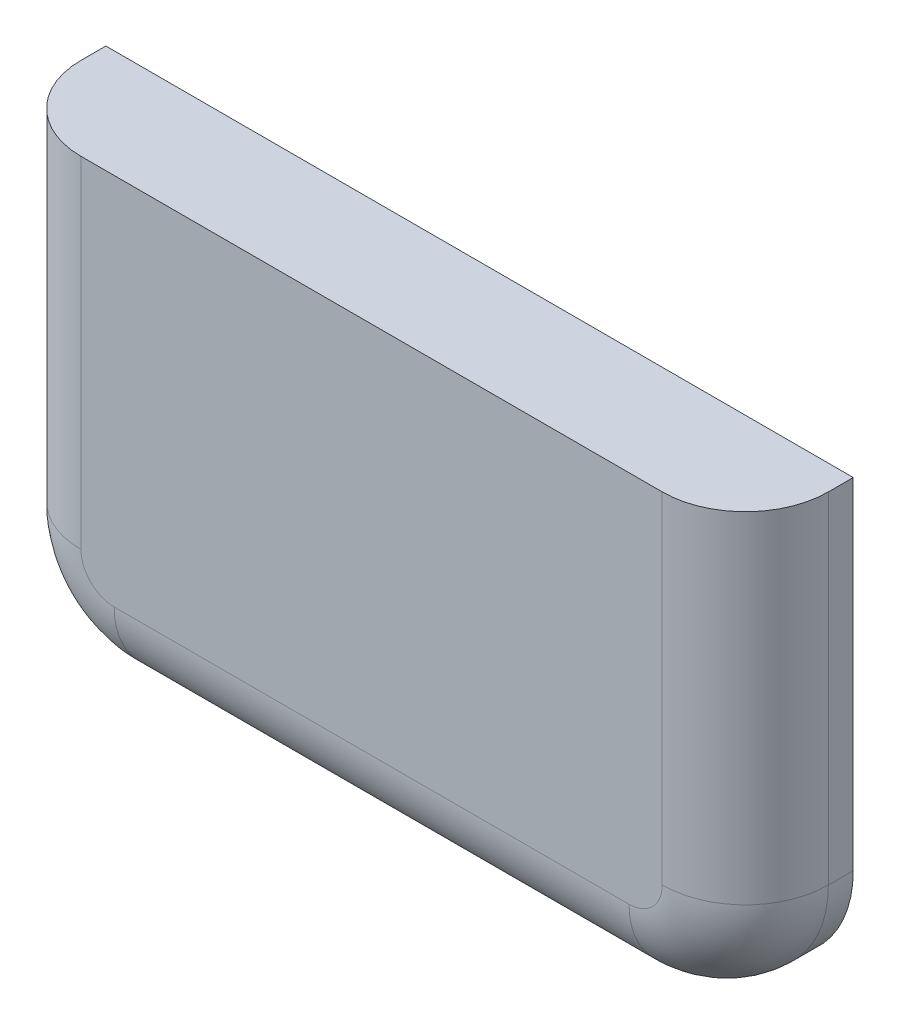
ISO-10303-21;
HEADER;
FILE_DESCRIPTION(('STEP AP214'),'2;1');
FILE_NAME('part.step','',(''),(''),'','','');
FILE_SCHEMA(('AUTOMOTIVE_DESIGN { 1 0 10303 214 1 1 1 1 }'));
ENDSEC;
DATA;
#1=APPLICATION_CONTEXT('core data for automotive mechanical design processes');
#2=APPLICATION_PROTOCOL_DEFINITION('international standard','automotive_design',2000,#1);
#3=PRODUCT_CONTEXT('',#1,'mechanical');
#4=PRODUCT('Part','Part','',(#3));
#5=PRODUCT_RELATED_PRODUCT_CATEGORY('part','',(#4));
#6=PRODUCT_DEFINITION_FORMATION('','',#4);
#7=PRODUCT_DEFINITION_CONTEXT('part definition',#1,'design');
#8=PRODUCT_DEFINITION('design','',#6,#7);
#9=PRODUCT_DEFINITION_SHAPE('','',#8);
#10=(LENGTH_UNIT() NAMED_UNIT(*) SI_UNIT(.MILLI.,.METRE.));
#11=(NAMED_UNIT(*) PLANE_ANGLE_UNIT() SI_UNIT($,.RADIAN.));
#12=(NAMED_UNIT(*) SI_UNIT($,.STERADIAN.) SOLID_ANGLE_UNIT());
#13=UNCERTAINTY_MEASURE_WITH_UNIT(LENGTH_MEASURE(1.E-05),#10,'distance_accuracy_value','');
#14=(GEOMETRIC_REPRESENTATION_CONTEXT(3) GLOBAL_UNCERTAINTY_ASSIGNED_CONTEXT((#13)) GLOBAL_UNIT_ASSIGNED_CONTEXT((#10,
#11,#12)) REPRESENTATION_CONTEXT('',''));
#15=CARTESIAN_POINT('',(0.,0.,0.));
#16=DIRECTION('',(0.,0.,1.));
#17=DIRECTION('',(1.,0.,0.));
#18=AXIS2_PLACEMENT_3D('',#15,#16,#17);
#19=CARTESIAN_POINT('',(-225.,137.5,65.));
#20=DIRECTION('',(0.,1.,0.));
#21=DIRECTION('',(0.,0.,1.));
#22=AXIS2_PLACEMENT_3D('',#19,#20,#21);
#23=PLANE('',#22);
#24=DIRECTION('',(0.,0.,-1.));
#25=VECTOR('',#24,1.);
#26=CARTESIAN_POINT('',(-225.,137.5,65.));
#27=LINE('',#26,#25);
#28=CARTESIAN_POINT('',(-225.,137.5,15.));
#29=VERTEX_POINT('',#28);
#30=CARTESIAN_POINT('',(-225.,137.5,0.));
#31=VERTEX_POINT('',#30);
#32=EDGE_CURVE('E129',#29,#31,#27,.T.);
#33=ORIENTED_EDGE('',*,*,#32,.F.);
#34=CARTESIAN_POINT('',(-175.,137.5,15.));
#35=DIRECTION('',(0.,1.,0.));
#36=DIRECTION('',(0.,0.,1.));
#37=AXIS2_PLACEMENT_3D('',#34,#35,#36);
#38=CIRCLE('',#37,50.);
#39=CARTESIAN_POINT('',(-175.,137.5,65.));
#40=VERTEX_POINT('',#39);
#41=EDGE_CURVE('E183',#29,#40,#38,.T.);
#42=ORIENTED_EDGE('',*,*,#41,.T.);
#43=DIRECTION('',(1.,0.,0.));
#44=VECTOR('',#43,1.);
#45=CARTESIAN_POINT('',(-225.,137.5,65.));
#46=LINE('',#45,#44);
#47=CARTESIAN_POINT('',(175.,137.5,65.));
#48=VERTEX_POINT('',#47);
#49=EDGE_CURVE('E130',#40,#48,#46,.T.);
#50=ORIENTED_EDGE('',*,*,#49,.T.);
#51=CARTESIAN_POINT('',(175.,137.5,15.));
#52=DIRECTION('',(0.,1.,0.));
#53=DIRECTION('',(0.,0.,1.));
#54=AXIS2_PLACEMENT_3D('',#51,#52,#53);
#55=CIRCLE('',#54,50.);
#56=CARTESIAN_POINT('',(225.,137.5,15.));
#57=VERTEX_POINT('',#56);
#58=EDGE_CURVE('E127',#48,#57,#55,.T.);
#59=ORIENTED_EDGE('',*,*,#58,.T.);
#60=DIRECTION('',(0.,0.,-1.));
#61=VECTOR('',#60,1.);
#62=CARTESIAN_POINT('',(225.,137.5,65.));
#63=LINE('',#62,#61);
#64=CARTESIAN_POINT('',(225.,137.5,0.));
#65=VERTEX_POINT('',#64);
#66=EDGE_CURVE('E120',#57,#65,#63,.T.);
#67=ORIENTED_EDGE('',*,*,#66,.T.);
#68=DIRECTION('',(1.,0.,0.));
#69=VECTOR('',#68,1.);
#70=CARTESIAN_POINT('',(-225.,137.5,0.));
#71=LINE('',#70,#69);
#72=EDGE_CURVE('E124',#31,#65,#71,.T.);
#73=ORIENTED_EDGE('',*,*,#72,.F.);
#74=EDGE_LOOP('',(#33,#42,#50,#59,#67,#73));
#75=FACE_BOUND('',#74,.T.);
#76=ADVANCED_FACE('F47',(#75),#23,.T.);
#77=CARTESIAN_POINT('',(-225.,-137.5,65.));
#78=DIRECTION('',(-1.,0.,0.));
#79=DIRECTION('',(0.,0.,1.));
#80=AXIS2_PLACEMENT_3D('',#77,#78,#79);
#81=PLANE('',#80);
#82=DIRECTION('',(0.,0.,-1.));
#83=VECTOR('',#82,1.);
#84=CARTESIAN_POINT('',(-225.,-67.4999999999999,65.));
#85=LINE('',#84,#83);
#86=CARTESIAN_POINT('',(-225.,-67.4999999999999,0.));
#87=VERTEX_POINT('',#86);
#88=CARTESIAN_POINT('',(-225.,-67.4999999999999,15.));
#89=VERTEX_POINT('',#88);
#90=EDGE_CURVE('E165',#87,#89,#85,.F.);
#91=ORIENTED_EDGE('',*,*,#90,.T.);
#92=DIRECTION('',(0.,1.,0.));
#93=VECTOR('',#92,1.);
#94=CARTESIAN_POINT('',(-225.,-137.5,15.));
#95=LINE('',#94,#93);
#96=EDGE_CURVE('E177',#89,#29,#95,.T.);
#97=ORIENTED_EDGE('',*,*,#96,.T.);
#98=ORIENTED_EDGE('',*,*,#32,.T.);
#99=DIRECTION('',(0.,1.,0.));
#100=VECTOR('',#99,1.);
#101=CARTESIAN_POINT('',(-225.,-137.5,0.));
#102=LINE('',#101,#100);
#103=EDGE_CURVE('E144',#87,#31,#102,.T.);
#104=ORIENTED_EDGE('',*,*,#103,.F.);
#105=EDGE_LOOP('',(#91,#97,#98,#104));
#106=FACE_BOUND('',#105,.T.);
#107=ADVANCED_FACE('F241',(#106),#81,.T.);
#108=CARTESIAN_POINT('',(-225.,-137.5,65.));
#109=DIRECTION('',(0.,1.,0.));
#110=DIRECTION('',(0.,0.,1.));
#111=AXIS2_PLACEMENT_3D('',#108,#109,#110);
#112=PLANE('',#111);
#113=DIRECTION('',(0.,0.,-1.));
#114=VECTOR('',#113,1.);
#115=CARTESIAN_POINT('',(155.,-137.5,65.));
#116=LINE('',#115,#114);
#117=CARTESIAN_POINT('',(155.,-137.5,0.));
#118=VERTEX_POINT('',#117);
#119=CARTESIAN_POINT('',(155.,-137.5,15.));
#120=VERTEX_POINT('',#119);
#121=EDGE_CURVE('E174',#118,#120,#116,.F.);
#122=ORIENTED_EDGE('',*,*,#121,.T.);
#123=DIRECTION('',(1.,0.,0.));
#124=VECTOR('',#123,1.);
#125=CARTESIAN_POINT('',(-155.,-137.5,15.));
#126=LINE('',#125,#124);
#127=CARTESIAN_POINT('',(-155.,-137.5,15.));
#128=VERTEX_POINT('',#127);
#129=EDGE_CURVE('E11',#120,#128,#126,.F.);
#130=ORIENTED_EDGE('',*,*,#129,.T.);
#131=DIRECTION('',(0.,0.,-1.));
#132=VECTOR('',#131,1.);
#133=CARTESIAN_POINT('',(-155.,-137.5,0.));
#134=LINE('',#133,#132);
#135=CARTESIAN_POINT('',(-155.,-137.5,0.));
#136=VERTEX_POINT('',#135);
#137=EDGE_CURVE('E158',#128,#136,#134,.T.);
#138=ORIENTED_EDGE('',*,*,#137,.T.);
#139=DIRECTION('',(1.,0.,0.));
#140=VECTOR('',#139,1.);
#141=CARTESIAN_POINT('',(-225.,-137.5,0.));
#142=LINE('',#141,#140);
#143=EDGE_CURVE('E139',#136,#118,#142,.T.);
#144=ORIENTED_EDGE('',*,*,#143,.T.);
#145=EDGE_LOOP('',(#122,#130,#138,#144));
#146=FACE_BOUND('',#145,.T.);
#147=ADVANCED_FACE('F247',(#146),#112,.F.);
#148=CARTESIAN_POINT('',(225.,-137.5,65.));
#149=DIRECTION('',(-1.,0.,0.));
#150=DIRECTION('',(0.,0.,1.));
#151=AXIS2_PLACEMENT_3D('',#148,#149,#150);
#152=PLANE('',#151);
#153=ORIENTED_EDGE('',*,*,#66,.F.);
#154=DIRECTION('',(0.,1.,0.));
#155=VECTOR('',#154,1.);
#156=CARTESIAN_POINT('',(225.,-67.4999999999999,15.));
#157=LINE('',#156,#155);
#158=CARTESIAN_POINT('',(225.,-67.4999999999999,15.));
#159=VERTEX_POINT('',#158);
#160=EDGE_CURVE('E72',#57,#159,#157,.F.);
#161=ORIENTED_EDGE('',*,*,#160,.T.);
#162=DIRECTION('',(0.,0.,-1.));
#163=VECTOR('',#162,1.);
#164=CARTESIAN_POINT('',(225.,-67.4999999999999,65.));
#165=LINE('',#164,#163);
#166=CARTESIAN_POINT('',(225.,-67.4999999999999,0.));
#167=VERTEX_POINT('',#166);
#168=EDGE_CURVE('E135',#159,#167,#165,.T.);
#169=ORIENTED_EDGE('',*,*,#168,.T.);
#170=DIRECTION('',(0.,1.,0.));
#171=VECTOR('',#170,1.);
#172=CARTESIAN_POINT('',(225.,-137.5,0.));
#173=LINE('',#172,#171);
#174=EDGE_CURVE('E133',#167,#65,#173,.T.);
#175=ORIENTED_EDGE('',*,*,#174,.T.);
#176=EDGE_LOOP('',(#153,#161,#169,#175));
#177=FACE_BOUND('',#176,.T.);
#178=ADVANCED_FACE('F134',(#177),#152,.F.);
#179=CARTESIAN_POINT('',(0.,0.,65.));
#180=DIRECTION('',(0.,0.,1.));
#181=DIRECTION('',(1.,0.,0.));
#182=AXIS2_PLACEMENT_3D('',#179,#180,#181);
#183=PLANE('',#182);
#184=ORIENTED_EDGE('',*,*,#49,.F.);
#185=DIRECTION('',(0.,1.,0.));
#186=VECTOR('',#185,1.);
#187=CARTESIAN_POINT('',(-175.,0.,65.));
#188=LINE('',#187,#186);
#189=CARTESIAN_POINT('',(-175.,-67.4999999999999,65.));
#190=VERTEX_POINT('',#189);
#191=EDGE_CURVE('E198',#40,#190,#188,.F.);
#192=ORIENTED_EDGE('',*,*,#191,.T.);
#193=CARTESIAN_POINT('',(-155.,-67.4999999999999,65.));
#194=DIRECTION('',(0.,0.,1.));
#195=DIRECTION('',(1.,0.,0.));
#196=AXIS2_PLACEMENT_3D('',#193,#194,#195);
#197=CIRCLE('',#196,20.);
#198=CARTESIAN_POINT('',(-155.,-87.5,65.));
#199=VERTEX_POINT('',#198);
#200=EDGE_CURVE('E195',#190,#199,#197,.T.);
#201=ORIENTED_EDGE('',*,*,#200,.T.);
#202=DIRECTION('',(1.,0.,0.));
#203=VECTOR('',#202,1.);
#204=CARTESIAN_POINT('',(155.,-87.5,65.));
#205=LINE('',#204,#203);
#206=CARTESIAN_POINT('',(155.,-87.5,65.));
#207=VERTEX_POINT('',#206);
#208=EDGE_CURVE('E186',#199,#207,#205,.T.);
#209=ORIENTED_EDGE('',*,*,#208,.T.);
#210=CARTESIAN_POINT('',(155.,-67.4999999999999,65.));
#211=DIRECTION('',(0.,0.,1.));
#212=DIRECTION('',(1.,0.,0.));
#213=AXIS2_PLACEMENT_3D('',#210,#211,#212);
#214=CIRCLE('',#213,20.);
#215=CARTESIAN_POINT('',(175.,-67.4999999999999,65.));
#216=VERTEX_POINT('',#215);
#217=EDGE_CURVE('E189',#207,#216,#214,.T.);
#218=ORIENTED_EDGE('',*,*,#217,.T.);
#219=DIRECTION('',(0.,1.,0.));
#220=VECTOR('',#219,1.);
#221=CARTESIAN_POINT('',(175.,137.5,65.));
#222=LINE('',#221,#220);
#223=EDGE_CURVE('E192',#216,#48,#222,.T.);
#224=ORIENTED_EDGE('',*,*,#223,.T.);
#225=EDGE_LOOP('',(#184,#192,#201,#209,#218,#224));
#226=FACE_BOUND('',#225,.T.);
#227=ADVANCED_FACE('F230',(#226),#183,.T.);
#228=CARTESIAN_POINT('',(0.,0.,0.));
#229=DIRECTION('',(0.,0.,1.));
#230=DIRECTION('',(1.,0.,0.));
#231=AXIS2_PLACEMENT_3D('',#228,#229,#230);
#232=PLANE('',#231);
#233=ORIENTED_EDGE('',*,*,#174,.F.);
#234=CARTESIAN_POINT('',(155.,-67.4999999999999,0.));
#235=DIRECTION('',(0.,0.,1.));
#236=DIRECTION('',(1.,0.,0.));
#237=AXIS2_PLACEMENT_3D('',#234,#235,#236);
#238=CIRCLE('',#237,70.);
#239=EDGE_CURVE('E171',#167,#118,#238,.F.);
#240=ORIENTED_EDGE('',*,*,#239,.T.);
#241=ORIENTED_EDGE('',*,*,#143,.F.);
#242=CARTESIAN_POINT('',(-155.,-67.4999999999999,0.));
#243=DIRECTION('',(0.,0.,1.));
#244=DIRECTION('',(1.,0.,0.));
#245=AXIS2_PLACEMENT_3D('',#242,#243,#244);
#246=CIRCLE('',#245,70.);
#247=EDGE_CURVE('E162',#136,#87,#246,.F.);
#248=ORIENTED_EDGE('',*,*,#247,.T.);
#249=ORIENTED_EDGE('',*,*,#103,.T.);
#250=ORIENTED_EDGE('',*,*,#72,.T.);
#251=EDGE_LOOP('',(#233,#240,#241,#248,#249,#250));
#252=FACE_BOUND('',#251,.T.);
#253=ADVANCED_FACE('F142',(#252),#232,.F.);
#254=CARTESIAN_POINT('',(-155.,-67.4999999999999,65.));
#255=DIRECTION('',(0.,0.,1.));
#256=DIRECTION('',(1.,0.,0.));
#257=AXIS2_PLACEMENT_3D('',#254,#255,#256);
#258=CYLINDRICAL_SURFACE('',#257,70.);
#259=ORIENTED_EDGE('',*,*,#137,.F.);
#260=CARTESIAN_POINT('',(-155.,-67.4999999999999,15.));
#261=DIRECTION('',(0.,0.,1.));
#262=DIRECTION('',(1.,0.,0.));
#263=AXIS2_PLACEMENT_3D('',#260,#261,#262);
#264=CIRCLE('',#263,70.);
#265=EDGE_CURVE('E201',#128,#89,#264,.F.);
#266=ORIENTED_EDGE('',*,*,#265,.T.);
#267=ORIENTED_EDGE('',*,*,#90,.F.);
#268=ORIENTED_EDGE('',*,*,#247,.F.);
#269=EDGE_LOOP('',(#259,#266,#267,#268));
#270=FACE_BOUND('',#269,.T.);
#271=ADVANCED_FACE('F238',(#270),#258,.T.);
#272=CARTESIAN_POINT('',(155.,-67.4999999999999,65.));
#273=DIRECTION('',(0.,0.,-1.));
#274=DIRECTION('',(-1.,0.,0.));
#275=AXIS2_PLACEMENT_3D('',#272,#273,#274);
#276=CYLINDRICAL_SURFACE('',#275,70.);
#277=ORIENTED_EDGE('',*,*,#168,.F.);
#278=CARTESIAN_POINT('',(155.,-67.4999999999999,15.));
#279=DIRECTION('',(0.,0.,1.));
#280=DIRECTION('',(1.,0.,0.));
#281=AXIS2_PLACEMENT_3D('',#278,#279,#280);
#282=CIRCLE('',#281,70.);
#283=EDGE_CURVE('E57',#159,#120,#282,.F.);
#284=ORIENTED_EDGE('',*,*,#283,.T.);
#285=ORIENTED_EDGE('',*,*,#121,.F.);
#286=ORIENTED_EDGE('',*,*,#239,.F.);
#287=EDGE_LOOP('',(#277,#284,#285,#286));
#288=FACE_BOUND('',#287,.T.);
#289=ADVANCED_FACE('F233',(#288),#276,.T.);
#290=CARTESIAN_POINT('',(175.,0.,15.));
#291=DIRECTION('',(0.,-1.,0.));
#292=DIRECTION('',(0.,0.,-1.));
#293=AXIS2_PLACEMENT_3D('',#290,#291,#292);
#294=CYLINDRICAL_SURFACE('',#293,50.);
#295=ORIENTED_EDGE('',*,*,#58,.F.);
#296=ORIENTED_EDGE('',*,*,#223,.F.);
#297=CARTESIAN_POINT('',(175.,-67.4999999999999,15.));
#298=DIRECTION('',(0.,-1.,0.));
#299=DIRECTION('',(0.,0.,-1.));
#300=AXIS2_PLACEMENT_3D('',#297,#298,#299);
#301=CIRCLE('',#300,50.);
#302=EDGE_CURVE('E51',#159,#216,#301,.T.);
#303=ORIENTED_EDGE('',*,*,#302,.F.);
#304=ORIENTED_EDGE('',*,*,#160,.F.);
#305=EDGE_LOOP('',(#295,#296,#303,#304));
#306=FACE_BOUND('',#305,.T.);
#307=ADVANCED_FACE('F49',(#306),#294,.T.);
#308=CARTESIAN_POINT('',(155.,-67.4999999999999,15.));
#309=DIRECTION('',(0.,0.,1.));
#310=DIRECTION('',(1.,0.,0.));
#311=AXIS2_PLACEMENT_3D('',#308,#309,#310);
#312=DEGENERATE_TOROIDAL_SURFACE('',#311,20.,50.,.T.);
#313=ORIENTED_EDGE('',*,*,#302,.T.);
#314=ORIENTED_EDGE('',*,*,#217,.F.);
#315=CARTESIAN_POINT('',(155.,-87.5,15.));
#316=DIRECTION('',(-1.,0.,0.));
#317=DIRECTION('',(0.,0.,1.));
#318=AXIS2_PLACEMENT_3D('',#315,#316,#317);
#319=CIRCLE('',#318,50.);
#320=EDGE_CURVE('E149',#120,#207,#319,.T.);
#321=ORIENTED_EDGE('',*,*,#320,.F.);
#322=ORIENTED_EDGE('',*,*,#283,.F.);
#323=EDGE_LOOP('',(#313,#314,#321,#322));
#324=FACE_BOUND('',#323,.T.);
#325=ADVANCED_FACE('F225',(#324),#312,.T.);
#326=CARTESIAN_POINT('',(0.,-87.5,15.));
#327=DIRECTION('',(-1.,0.,0.));
#328=DIRECTION('',(0.,0.,1.));
#329=AXIS2_PLACEMENT_3D('',#326,#327,#328);
#330=CYLINDRICAL_SURFACE('',#329,50.);
#331=ORIENTED_EDGE('',*,*,#320,.T.);
#332=ORIENTED_EDGE('',*,*,#208,.F.);
#333=CARTESIAN_POINT('',(-155.,-87.5,15.));
#334=DIRECTION('',(-1.,0.,0.));
#335=DIRECTION('',(0.,0.,1.));
#336=AXIS2_PLACEMENT_3D('',#333,#334,#335);
#337=CIRCLE('',#336,50.);
#338=EDGE_CURVE('E212',#128,#199,#337,.T.);
#339=ORIENTED_EDGE('',*,*,#338,.F.);
#340=ORIENTED_EDGE('',*,*,#129,.F.);
#341=EDGE_LOOP('',(#331,#332,#339,#340));
#342=FACE_BOUND('',#341,.T.);
#343=ADVANCED_FACE('F221',(#342),#330,.T.);
#344=CARTESIAN_POINT('',(-155.,-67.4999999999999,15.));
#345=DIRECTION('',(0.,0.,1.));
#346=DIRECTION('',(1.,0.,0.));
#347=AXIS2_PLACEMENT_3D('',#344,#345,#346);
#348=DEGENERATE_TOROIDAL_SURFACE('',#347,20.,50.,.T.);
#349=ORIENTED_EDGE('',*,*,#338,.T.);
#350=ORIENTED_EDGE('',*,*,#200,.F.);
#351=CARTESIAN_POINT('',(-175.,-67.4999999999999,15.));
#352=DIRECTION('',(0.,1.,0.));
#353=DIRECTION('',(0.,0.,1.));
#354=AXIS2_PLACEMENT_3D('',#351,#352,#353);
#355=CIRCLE('',#354,50.);
#356=EDGE_CURVE('E208',#89,#190,#355,.T.);
#357=ORIENTED_EDGE('',*,*,#356,.F.);
#358=ORIENTED_EDGE('',*,*,#265,.F.);
#359=EDGE_LOOP('',(#349,#350,#357,#358));
#360=FACE_BOUND('',#359,.T.);
#361=ADVANCED_FACE('F259',(#360),#348,.T.);
#362=CARTESIAN_POINT('',(-175.,-137.5,15.));
#363=DIRECTION('',(0.,1.,0.));
#364=DIRECTION('',(0.,0.,1.));
#365=AXIS2_PLACEMENT_3D('',#362,#363,#364);
#366=CYLINDRICAL_SURFACE('',#365,50.);
#367=ORIENTED_EDGE('',*,*,#356,.T.);
#368=ORIENTED_EDGE('',*,*,#191,.F.);
#369=ORIENTED_EDGE('',*,*,#41,.F.);
#370=ORIENTED_EDGE('',*,*,#96,.F.);
#371=EDGE_LOOP('',(#367,#368,#369,#370));
#372=FACE_BOUND('',#371,.T.);
#373=ADVANCED_FACE('F256',(#372),#366,.T.);
#374=CLOSED_SHELL('',(#76,#107,#147,#178,#227,#253,#271,#289,#307,#325,#343,#361,#373));
#375=MANIFOLD_SOLID_BREP('B2',#374);
#376=ADVANCED_BREP_SHAPE_REPRESENTATION('',(#18,#375),#14);
#377=SHAPE_DEFINITION_REPRESENTATION(#9,#376);
ENDSEC;
END-ISO-10303-21;
